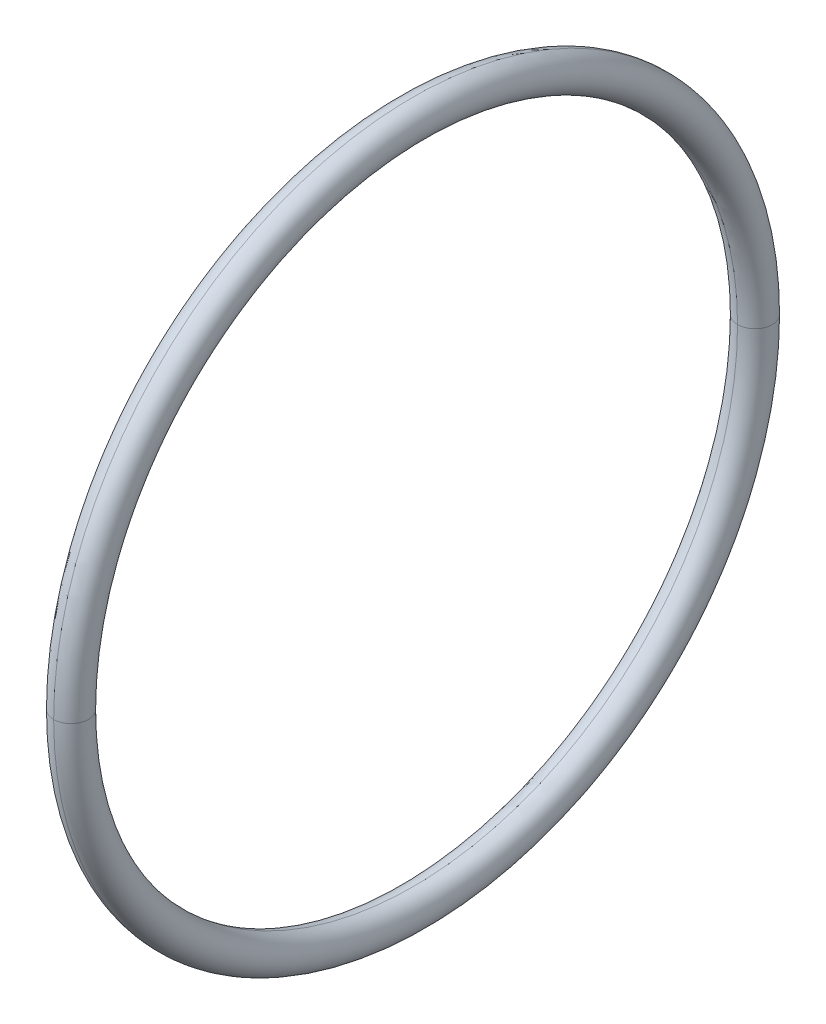
ISO-10303-21;
HEADER;
FILE_DESCRIPTION(('STEP AP214'),'2;1');
FILE_NAME('part.step','',(''),(''),'','','');
FILE_SCHEMA(('AUTOMOTIVE_DESIGN { 1 0 10303 214 1 1 1 1 }'));
ENDSEC;
DATA;
#1=APPLICATION_CONTEXT('core data for automotive mechanical design processes');
#2=APPLICATION_PROTOCOL_DEFINITION('international standard','automotive_design',2000,#1);
#3=PRODUCT_CONTEXT('',#1,'mechanical');
#4=PRODUCT('Part','Part','',(#3));
#5=PRODUCT_RELATED_PRODUCT_CATEGORY('part','',(#4));
#6=PRODUCT_DEFINITION_FORMATION('','',#4);
#7=PRODUCT_DEFINITION_CONTEXT('part definition',#1,'design');
#8=PRODUCT_DEFINITION('design','',#6,#7);
#9=PRODUCT_DEFINITION_SHAPE('','',#8);
#10=(LENGTH_UNIT() NAMED_UNIT(*) SI_UNIT(.MILLI.,.METRE.));
#11=(NAMED_UNIT(*) PLANE_ANGLE_UNIT() SI_UNIT($,.RADIAN.));
#12=(NAMED_UNIT(*) SI_UNIT($,.STERADIAN.) SOLID_ANGLE_UNIT());
#13=UNCERTAINTY_MEASURE_WITH_UNIT(LENGTH_MEASURE(1.E-05),#10,'distance_accuracy_value','');
#14=(GEOMETRIC_REPRESENTATION_CONTEXT(3) GLOBAL_UNCERTAINTY_ASSIGNED_CONTEXT((#13)) GLOBAL_UNIT_ASSIGNED_CONTEXT((#10,
#11,#12)) REPRESENTATION_CONTEXT('',''));
#15=CARTESIAN_POINT('',(0.,0.,0.));
#16=DIRECTION('',(0.,0.,1.));
#17=DIRECTION('',(1.,0.,0.));
#18=AXIS2_PLACEMENT_3D('',#15,#16,#17);
#19=CARTESIAN_POINT('',(-25.,0.,0.));
#20=DIRECTION('',(1.,0.,0.));
#21=DIRECTION('',(0.,0.,-1.));
#22=AXIS2_PLACEMENT_3D('',#19,#20,#21);
#23=TOROIDAL_SURFACE('',#22,29.5,1.5);
#24=CARTESIAN_POINT('',(-25.,0.,0.));
#25=DIRECTION('',(1.,0.,0.));
#26=DIRECTION('',(0.,0.,-1.));
#27=AXIS2_PLACEMENT_3D('',#24,#25,#26);
#28=CIRCLE('',#27,31.);
#29=CARTESIAN_POINT('',(-25.,0.,31.));
#30=VERTEX_POINT('',#29);
#31=CARTESIAN_POINT('',(-25.,0.,-31.));
#32=VERTEX_POINT('',#31);
#33=EDGE_CURVE('E71',#30,#32,#28,.T.);
#34=ORIENTED_EDGE('',*,*,#33,.F.);
#35=CARTESIAN_POINT('',(-25.,0.,29.5));
#36=DIRECTION('',(0.,1.,0.));
#37=DIRECTION('',(0.,0.,1.));
#38=AXIS2_PLACEMENT_3D('',#35,#36,#37);
#39=CIRCLE('',#38,1.5);
#40=CARTESIAN_POINT('',(-25.,0.,28.));
#41=VERTEX_POINT('',#40);
#42=EDGE_CURVE('E11',#41,#30,#39,.T.);
#43=ORIENTED_EDGE('',*,*,#42,.F.);
#44=CARTESIAN_POINT('',(-25.,0.,0.));
#45=DIRECTION('',(1.,0.,0.));
#46=DIRECTION('',(0.,0.,-1.));
#47=AXIS2_PLACEMENT_3D('',#44,#45,#46);
#48=CIRCLE('',#47,28.);
#49=CARTESIAN_POINT('',(-25.,0.,-28.));
#50=VERTEX_POINT('',#49);
#51=EDGE_CURVE('E70',#41,#50,#48,.T.);
#52=ORIENTED_EDGE('',*,*,#51,.T.);
#53=CARTESIAN_POINT('',(-25.,0.,-29.5));
#54=DIRECTION('',(0.,-1.,0.));
#55=DIRECTION('',(0.,0.,-1.));
#56=AXIS2_PLACEMENT_3D('',#53,#54,#55);
#57=CIRCLE('',#56,1.5);
#58=EDGE_CURVE('E26',#50,#32,#57,.T.);
#59=ORIENTED_EDGE('',*,*,#58,.T.);
#60=EDGE_LOOP('',(#34,#43,#52,#59));
#61=FACE_BOUND('',#60,.T.);
#62=ADVANCED_FACE('F16',(#61),#23,.T.);
#63=CARTESIAN_POINT('',(-25.,0.,0.));
#64=DIRECTION('',(1.,0.,0.));
#65=DIRECTION('',(0.,0.,-1.));
#66=AXIS2_PLACEMENT_3D('',#63,#64,#65);
#67=TOROIDAL_SURFACE('',#66,29.5,1.5);
#68=CARTESIAN_POINT('',(-25.,0.,0.));
#69=DIRECTION('',(1.,0.,0.));
#70=DIRECTION('',(0.,0.,-1.));
#71=AXIS2_PLACEMENT_3D('',#68,#69,#70);
#72=CIRCLE('',#71,31.);
#73=EDGE_CURVE('E58',#32,#30,#72,.T.);
#74=ORIENTED_EDGE('',*,*,#73,.F.);
#75=ORIENTED_EDGE('',*,*,#58,.F.);
#76=CARTESIAN_POINT('',(-25.,0.,0.));
#77=DIRECTION('',(1.,0.,0.));
#78=DIRECTION('',(0.,0.,-1.));
#79=AXIS2_PLACEMENT_3D('',#76,#77,#78);
#80=CIRCLE('',#79,28.);
#81=EDGE_CURVE('E20',#50,#41,#80,.T.);
#82=ORIENTED_EDGE('',*,*,#81,.T.);
#83=ORIENTED_EDGE('',*,*,#42,.T.);
#84=EDGE_LOOP('',(#74,#75,#82,#83));
#85=FACE_BOUND('',#84,.T.);
#86=ADVANCED_FACE('F57',(#85),#67,.T.);
#87=CARTESIAN_POINT('',(-25.,0.,0.));
#88=DIRECTION('',(1.,0.,0.));
#89=DIRECTION('',(0.,0.,-1.));
#90=AXIS2_PLACEMENT_3D('',#87,#88,#89);
#91=TOROIDAL_SURFACE('',#90,29.5,1.5);
#92=CARTESIAN_POINT('',(-25.,0.,-29.5));
#93=DIRECTION('',(0.,-1.,0.));
#94=DIRECTION('',(0.,0.,-1.));
#95=AXIS2_PLACEMENT_3D('',#92,#93,#94);
#96=CIRCLE('',#95,1.5);
#97=EDGE_CURVE('E67',#32,#50,#96,.T.);
#98=ORIENTED_EDGE('',*,*,#97,.F.);
#99=ORIENTED_EDGE('',*,*,#73,.T.);
#100=CARTESIAN_POINT('',(-25.,0.,29.5));
#101=DIRECTION('',(0.,1.,0.));
#102=DIRECTION('',(0.,0.,1.));
#103=AXIS2_PLACEMENT_3D('',#100,#101,#102);
#104=CIRCLE('',#103,1.5);
#105=EDGE_CURVE('E65',#30,#41,#104,.T.);
#106=ORIENTED_EDGE('',*,*,#105,.T.);
#107=ORIENTED_EDGE('',*,*,#81,.F.);
#108=EDGE_LOOP('',(#98,#99,#106,#107));
#109=FACE_BOUND('',#108,.T.);
#110=ADVANCED_FACE('F63',(#109),#91,.T.);
#111=CARTESIAN_POINT('',(-25.,0.,0.));
#112=DIRECTION('',(1.,0.,0.));
#113=DIRECTION('',(0.,0.,-1.));
#114=AXIS2_PLACEMENT_3D('',#111,#112,#113);
#115=TOROIDAL_SURFACE('',#114,29.5,1.5);
#116=ORIENTED_EDGE('',*,*,#105,.F.);
#117=ORIENTED_EDGE('',*,*,#33,.T.);
#118=ORIENTED_EDGE('',*,*,#97,.T.);
#119=ORIENTED_EDGE('',*,*,#51,.F.);
#120=EDGE_LOOP('',(#116,#117,#118,#119));
#121=FACE_BOUND('',#120,.T.);
#122=ADVANCED_FACE('F18',(#121),#115,.T.);
#123=CLOSED_SHELL('',(#62,#86,#110,#122));
#124=MANIFOLD_SOLID_BREP('B1',#123);
#125=ADVANCED_BREP_SHAPE_REPRESENTATION('',(#18,#124),#14);
#126=SHAPE_DEFINITION_REPRESENTATION(#9,#125);
ENDSEC;
END-ISO-10303-21;
